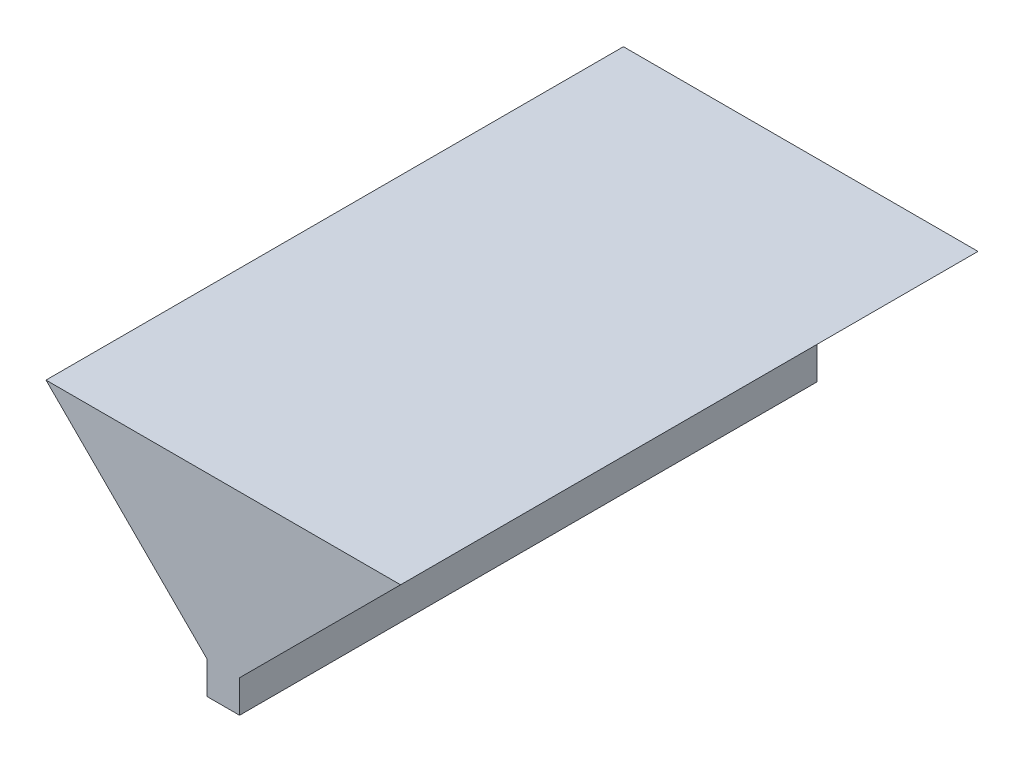
ISO-10303-21;
HEADER;
FILE_DESCRIPTION(('STEP AP214'),'2;1');
FILE_NAME('part.step','',(''),(''),'','','');
FILE_SCHEMA(('AUTOMOTIVE_DESIGN { 1 0 10303 214 1 1 1 1 }'));
ENDSEC;
DATA;
#1=APPLICATION_CONTEXT('core data for automotive mechanical design processes');
#2=APPLICATION_PROTOCOL_DEFINITION('international standard','automotive_design',2000,#1);
#3=PRODUCT_CONTEXT('',#1,'mechanical');
#4=PRODUCT('Part','Part','',(#3));
#5=PRODUCT_RELATED_PRODUCT_CATEGORY('part','',(#4));
#6=PRODUCT_DEFINITION_FORMATION('','',#4);
#7=PRODUCT_DEFINITION_CONTEXT('part definition',#1,'design');
#8=PRODUCT_DEFINITION('design','',#6,#7);
#9=PRODUCT_DEFINITION_SHAPE('','',#8);
#10=(LENGTH_UNIT() NAMED_UNIT(*) SI_UNIT(.MILLI.,.METRE.));
#11=(NAMED_UNIT(*) PLANE_ANGLE_UNIT() SI_UNIT($,.RADIAN.));
#12=(NAMED_UNIT(*) SI_UNIT($,.STERADIAN.) SOLID_ANGLE_UNIT());
#13=UNCERTAINTY_MEASURE_WITH_UNIT(LENGTH_MEASURE(1.E-05),#10,'distance_accuracy_value','');
#14=(GEOMETRIC_REPRESENTATION_CONTEXT(3) GLOBAL_UNCERTAINTY_ASSIGNED_CONTEXT((#13)) GLOBAL_UNIT_ASSIGNED_CONTEXT((#10,
#11,#12)) REPRESENTATION_CONTEXT('',''));
#15=CARTESIAN_POINT('',(0.,0.,0.));
#16=DIRECTION('',(0.,0.,1.));
#17=DIRECTION('',(1.,0.,0.));
#18=AXIS2_PLACEMENT_3D('',#15,#16,#17);
#19=CARTESIAN_POINT('',(0.,0.,35.5));
#20=DIRECTION('',(0.,1.,0.));
#21=DIRECTION('',(0.,0.,1.));
#22=AXIS2_PLACEMENT_3D('',#19,#20,#21);
#23=PLANE('',#22);
#24=DIRECTION('',(1.,0.,0.));
#25=VECTOR('',#24,1.);
#26=CARTESIAN_POINT('',(0.,0.,0.));
#27=LINE('',#26,#25);
#28=CARTESIAN_POINT('',(0.,0.,0.));
#29=VERTEX_POINT('',#28);
#30=CARTESIAN_POINT('',(2.,0.,0.));
#31=VERTEX_POINT('',#30);
#32=EDGE_CURVE('E132',#29,#31,#27,.T.);
#33=ORIENTED_EDGE('',*,*,#32,.T.);
#34=DIRECTION('',(0.,0.,-1.));
#35=VECTOR('',#34,1.);
#36=CARTESIAN_POINT('',(2.,0.,35.5));
#37=LINE('',#36,#35);
#38=CARTESIAN_POINT('',(2.,0.,35.5));
#39=VERTEX_POINT('',#38);
#40=EDGE_CURVE('E11',#39,#31,#37,.T.);
#41=ORIENTED_EDGE('',*,*,#40,.F.);
#42=DIRECTION('',(1.,0.,0.));
#43=VECTOR('',#42,1.);
#44=CARTESIAN_POINT('',(0.,0.,35.5));
#45=LINE('',#44,#43);
#46=CARTESIAN_POINT('',(0.,0.,35.5));
#47=VERTEX_POINT('',#46);
#48=EDGE_CURVE('E148',#47,#39,#45,.T.);
#49=ORIENTED_EDGE('',*,*,#48,.F.);
#50=DIRECTION('',(0.,0.,-1.));
#51=VECTOR('',#50,1.);
#52=CARTESIAN_POINT('',(0.,0.,35.5));
#53=LINE('',#52,#51);
#54=EDGE_CURVE('E128',#47,#29,#53,.T.);
#55=ORIENTED_EDGE('',*,*,#54,.T.);
#56=EDGE_LOOP('',(#33,#41,#49,#55));
#57=FACE_BOUND('',#56,.T.);
#58=ADVANCED_FACE('F43',(#57),#23,.F.);
#59=CARTESIAN_POINT('',(2.,0.,35.5));
#60=DIRECTION('',(-1.,0.,0.));
#61=DIRECTION('',(0.,0.,1.));
#62=AXIS2_PLACEMENT_3D('',#59,#60,#61);
#63=PLANE('',#62);
#64=DIRECTION('',(0.,1.,0.));
#65=VECTOR('',#64,1.);
#66=CARTESIAN_POINT('',(2.,0.,0.));
#67=LINE('',#66,#65);
#68=CARTESIAN_POINT('',(2.,2.,0.));
#69=VERTEX_POINT('',#68);
#70=EDGE_CURVE('E136',#31,#69,#67,.T.);
#71=ORIENTED_EDGE('',*,*,#70,.T.);
#72=DIRECTION('',(0.,0.,-1.));
#73=VECTOR('',#72,1.);
#74=CARTESIAN_POINT('',(2.,2.,35.5));
#75=LINE('',#74,#73);
#76=CARTESIAN_POINT('',(2.,2.,35.5));
#77=VERTEX_POINT('',#76);
#78=EDGE_CURVE('E52',#77,#69,#75,.T.);
#79=ORIENTED_EDGE('',*,*,#78,.F.);
#80=DIRECTION('',(0.,1.,0.));
#81=VECTOR('',#80,1.);
#82=CARTESIAN_POINT('',(2.,0.,35.5));
#83=LINE('',#82,#81);
#84=EDGE_CURVE('E97',#39,#77,#83,.T.);
#85=ORIENTED_EDGE('',*,*,#84,.F.);
#86=ORIENTED_EDGE('',*,*,#40,.T.);
#87=EDGE_LOOP('',(#71,#79,#85,#86));
#88=FACE_BOUND('',#87,.T.);
#89=ADVANCED_FACE('F176',(#88),#63,.F.);
#90=CARTESIAN_POINT('',(2.,2.,35.5));
#91=DIRECTION('',(-0.707106781186547,0.707106781186548,0.));
#92=DIRECTION('',(-0.707106781186548,-0.707106781186547,0.));
#93=AXIS2_PLACEMENT_3D('',#90,#91,#92);
#94=PLANE('',#93);
#95=DIRECTION('',(0.707106781186548,0.707106781186548,0.));
#96=VECTOR('',#95,1.);
#97=CARTESIAN_POINT('',(2.,2.,0.));
#98=LINE('',#97,#96);
#99=CARTESIAN_POINT('',(11.8994949366117,11.8994949366117,0.));
#100=VERTEX_POINT('',#99);
#101=EDGE_CURVE('E139',#69,#100,#98,.T.);
#102=ORIENTED_EDGE('',*,*,#101,.T.);
#103=DIRECTION('',(0.,0.,-1.));
#104=VECTOR('',#103,1.);
#105=CARTESIAN_POINT('',(11.8994949366117,11.8994949366117,35.5));
#106=LINE('',#105,#104);
#107=CARTESIAN_POINT('',(11.8994949366117,11.8994949366117,35.5));
#108=VERTEX_POINT('',#107);
#109=EDGE_CURVE('E121',#108,#100,#106,.T.);
#110=ORIENTED_EDGE('',*,*,#109,.F.);
#111=DIRECTION('',(0.707106781186548,0.707106781186548,0.));
#112=VECTOR('',#111,1.);
#113=CARTESIAN_POINT('',(2.,2.,35.5));
#114=LINE('',#113,#112);
#115=EDGE_CURVE('E110',#77,#108,#114,.T.);
#116=ORIENTED_EDGE('',*,*,#115,.F.);
#117=ORIENTED_EDGE('',*,*,#78,.T.);
#118=EDGE_LOOP('',(#102,#110,#116,#117));
#119=FACE_BOUND('',#118,.T.);
#120=ADVANCED_FACE('F158',(#119),#94,.F.);
#121=CARTESIAN_POINT('',(-9.89949493661167,11.8994949366117,35.5));
#122=DIRECTION('',(0.,-1.,0.));
#123=DIRECTION('',(0.,0.,-1.));
#124=AXIS2_PLACEMENT_3D('',#121,#122,#123);
#125=PLANE('',#124);
#126=DIRECTION('',(-1.,0.,0.));
#127=VECTOR('',#126,1.);
#128=CARTESIAN_POINT('',(-9.89949493661167,11.8994949366117,0.));
#129=LINE('',#128,#127);
#130=CARTESIAN_POINT('',(-9.89949493661167,11.8994949366117,0.));
#131=VERTEX_POINT('',#130);
#132=EDGE_CURVE('E119',#100,#131,#129,.T.);
#133=ORIENTED_EDGE('',*,*,#132,.T.);
#134=DIRECTION('',(0.,0.,-1.));
#135=VECTOR('',#134,1.);
#136=CARTESIAN_POINT('',(-9.89949493661167,11.8994949366117,35.5));
#137=LINE('',#136,#135);
#138=CARTESIAN_POINT('',(-9.89949493661167,11.8994949366117,35.5));
#139=VERTEX_POINT('',#138);
#140=EDGE_CURVE('E116',#139,#131,#137,.T.);
#141=ORIENTED_EDGE('',*,*,#140,.F.);
#142=DIRECTION('',(-1.,0.,0.));
#143=VECTOR('',#142,1.);
#144=CARTESIAN_POINT('',(-9.89949493661167,11.8994949366117,35.5));
#145=LINE('',#144,#143);
#146=EDGE_CURVE('E104',#108,#139,#145,.T.);
#147=ORIENTED_EDGE('',*,*,#146,.F.);
#148=ORIENTED_EDGE('',*,*,#109,.T.);
#149=EDGE_LOOP('',(#133,#141,#147,#148));
#150=FACE_BOUND('',#149,.T.);
#151=ADVANCED_FACE('F117',(#150),#125,.F.);
#152=CARTESIAN_POINT('',(0.,2.,35.5));
#153=DIRECTION('',(0.707106781186547,0.707106781186547,0.));
#154=DIRECTION('',(-0.707106781186548,0.707106781186548,0.));
#155=AXIS2_PLACEMENT_3D('',#152,#153,#154);
#156=PLANE('',#155);
#157=DIRECTION('',(0.707106781186548,-0.707106781186548,0.));
#158=VECTOR('',#157,1.);
#159=CARTESIAN_POINT('',(0.,2.,0.));
#160=LINE('',#159,#158);
#161=CARTESIAN_POINT('',(0.,2.,0.));
#162=VERTEX_POINT('',#161);
#163=EDGE_CURVE('E83',#131,#162,#160,.T.);
#164=ORIENTED_EDGE('',*,*,#163,.T.);
#165=DIRECTION('',(0.,0.,-1.));
#166=VECTOR('',#165,1.);
#167=CARTESIAN_POINT('',(0.,2.,35.5));
#168=LINE('',#167,#166);
#169=CARTESIAN_POINT('',(0.,2.,35.5));
#170=VERTEX_POINT('',#169);
#171=EDGE_CURVE('E122',#170,#162,#168,.T.);
#172=ORIENTED_EDGE('',*,*,#171,.F.);
#173=DIRECTION('',(0.707106781186548,-0.707106781186548,0.));
#174=VECTOR('',#173,1.);
#175=CARTESIAN_POINT('',(0.,2.,35.5));
#176=LINE('',#175,#174);
#177=EDGE_CURVE('E108',#139,#170,#176,.T.);
#178=ORIENTED_EDGE('',*,*,#177,.F.);
#179=ORIENTED_EDGE('',*,*,#140,.T.);
#180=EDGE_LOOP('',(#164,#172,#178,#179));
#181=FACE_BOUND('',#180,.T.);
#182=ADVANCED_FACE('F124',(#181),#156,.F.);
#183=CARTESIAN_POINT('',(0.,0.,35.5));
#184=DIRECTION('',(1.,0.,0.));
#185=DIRECTION('',(0.,0.,-1.));
#186=AXIS2_PLACEMENT_3D('',#183,#184,#185);
#187=PLANE('',#186);
#188=DIRECTION('',(0.,-1.,0.));
#189=VECTOR('',#188,1.);
#190=CARTESIAN_POINT('',(0.,0.,0.));
#191=LINE('',#190,#189);
#192=EDGE_CURVE('E89',#162,#29,#191,.T.);
#193=ORIENTED_EDGE('',*,*,#192,.T.);
#194=ORIENTED_EDGE('',*,*,#54,.F.);
#195=DIRECTION('',(0.,-1.,0.));
#196=VECTOR('',#195,1.);
#197=CARTESIAN_POINT('',(0.,0.,35.5));
#198=LINE('',#197,#196);
#199=EDGE_CURVE('E60',#170,#47,#198,.T.);
#200=ORIENTED_EDGE('',*,*,#199,.F.);
#201=ORIENTED_EDGE('',*,*,#171,.T.);
#202=EDGE_LOOP('',(#193,#194,#200,#201));
#203=FACE_BOUND('',#202,.T.);
#204=ADVANCED_FACE('F165',(#203),#187,.F.);
#205=CARTESIAN_POINT('',(0.,0.,35.5));
#206=DIRECTION('',(0.,0.,1.));
#207=DIRECTION('',(1.,0.,0.));
#208=AXIS2_PLACEMENT_3D('',#205,#206,#207);
#209=PLANE('',#208);
#210=ORIENTED_EDGE('',*,*,#48,.T.);
#211=ORIENTED_EDGE('',*,*,#84,.T.);
#212=ORIENTED_EDGE('',*,*,#115,.T.);
#213=ORIENTED_EDGE('',*,*,#146,.T.);
#214=ORIENTED_EDGE('',*,*,#177,.T.);
#215=ORIENTED_EDGE('',*,*,#199,.T.);
#216=EDGE_LOOP('',(#210,#211,#212,#213,#214,#215));
#217=FACE_BOUND('',#216,.T.);
#218=ADVANCED_FACE('F106',(#217),#209,.T.);
#219=CARTESIAN_POINT('',(0.,0.,0.));
#220=DIRECTION('',(0.,0.,1.));
#221=DIRECTION('',(1.,0.,0.));
#222=AXIS2_PLACEMENT_3D('',#219,#220,#221);
#223=PLANE('',#222);
#224=ORIENTED_EDGE('',*,*,#32,.F.);
#225=ORIENTED_EDGE('',*,*,#192,.F.);
#226=ORIENTED_EDGE('',*,*,#163,.F.);
#227=ORIENTED_EDGE('',*,*,#132,.F.);
#228=ORIENTED_EDGE('',*,*,#101,.F.);
#229=ORIENTED_EDGE('',*,*,#70,.F.);
#230=EDGE_LOOP('',(#224,#225,#226,#227,#228,#229));
#231=FACE_BOUND('',#230,.T.);
#232=ADVANCED_FACE('F161',(#231),#223,.F.);
#233=CLOSED_SHELL('',(#58,#89,#120,#151,#182,#204,#218,#232));
#234=MANIFOLD_SOLID_BREP('B2',#233);
#235=ADVANCED_BREP_SHAPE_REPRESENTATION('',(#18,#234),#14);
#236=SHAPE_DEFINITION_REPRESENTATION(#9,#235);
ENDSEC;
END-ISO-10303-21;
